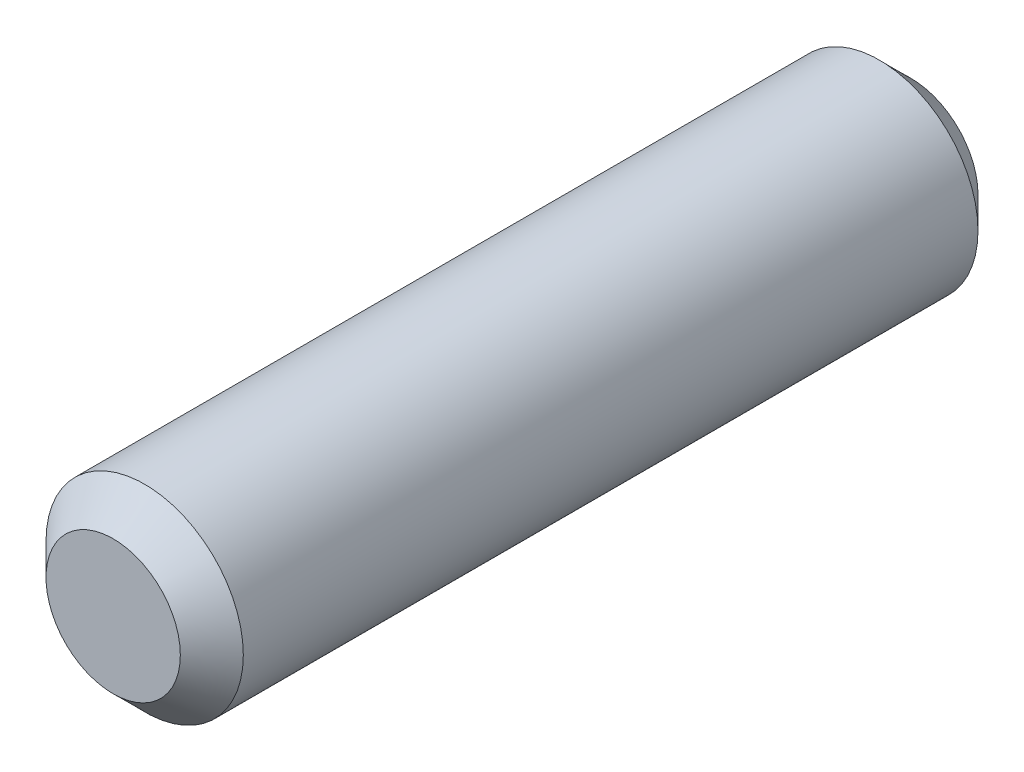
ISO-10303-21;
HEADER;
FILE_DESCRIPTION(('STEP AP214'),'2;1');
FILE_NAME('part.step','',(''),(''),'','','');
FILE_SCHEMA(('AUTOMOTIVE_DESIGN { 1 0 10303 214 1 1 1 1 }'));
ENDSEC;
DATA;
#1=APPLICATION_CONTEXT('core data for automotive mechanical design processes');
#2=APPLICATION_PROTOCOL_DEFINITION('international standard','automotive_design',2000,#1);
#3=PRODUCT_CONTEXT('',#1,'mechanical');
#4=PRODUCT('Part','Part','',(#3));
#5=PRODUCT_RELATED_PRODUCT_CATEGORY('part','',(#4));
#6=PRODUCT_DEFINITION_FORMATION('','',#4);
#7=PRODUCT_DEFINITION_CONTEXT('part definition',#1,'design');
#8=PRODUCT_DEFINITION('design','',#6,#7);
#9=PRODUCT_DEFINITION_SHAPE('','',#8);
#10=(LENGTH_UNIT() NAMED_UNIT(*) SI_UNIT(.MILLI.,.METRE.));
#11=(NAMED_UNIT(*) PLANE_ANGLE_UNIT() SI_UNIT($,.RADIAN.));
#12=(NAMED_UNIT(*) SI_UNIT($,.STERADIAN.) SOLID_ANGLE_UNIT());
#13=UNCERTAINTY_MEASURE_WITH_UNIT(LENGTH_MEASURE(1.E-05),#10,'distance_accuracy_value','');
#14=(GEOMETRIC_REPRESENTATION_CONTEXT(3) GLOBAL_UNCERTAINTY_ASSIGNED_CONTEXT((#13)) GLOBAL_UNIT_ASSIGNED_CONTEXT((#10,
#11,#12)) REPRESENTATION_CONTEXT('',''));
#15=CARTESIAN_POINT('',(0.,0.,0.));
#16=DIRECTION('',(0.,0.,1.));
#17=DIRECTION('',(1.,0.,0.));
#18=AXIS2_PLACEMENT_3D('',#15,#16,#17);
#19=CARTESIAN_POINT('',(0.,0.,19.));
#20=DIRECTION('',(0.,0.,-1.));
#21=DIRECTION('',(-1.,0.,0.));
#22=AXIS2_PLACEMENT_3D('',#19,#20,#21);
#23=CYLINDRICAL_SURFACE('',#22,2.35);
#24=CARTESIAN_POINT('',(0.,0.,18.25));
#25=DIRECTION('',(0.,0.,1.));
#26=DIRECTION('',(1.,0.,0.));
#27=AXIS2_PLACEMENT_3D('',#24,#25,#26);
#28=CIRCLE('',#27,2.35);
#29=CARTESIAN_POINT('',(2.35,0.,18.25));
#30=VERTEX_POINT('',#29);
#31=EDGE_CURVE('E51',#30,#30,#28,.F.);
#32=ORIENTED_EDGE('',*,*,#31,.T.);
#33=EDGE_LOOP('',(#32));
#34=FACE_BOUND('',#33,.T.);
#35=CARTESIAN_POINT('',(0.,0.,0.750000000000001));
#36=DIRECTION('',(0.,0.,1.));
#37=DIRECTION('',(1.,0.,0.));
#38=AXIS2_PLACEMENT_3D('',#35,#36,#37);
#39=CIRCLE('',#38,2.35);
#40=CARTESIAN_POINT('',(2.35,0.,0.750000000000001));
#41=VERTEX_POINT('',#40);
#42=EDGE_CURVE('E55',#41,#41,#39,.T.);
#43=ORIENTED_EDGE('',*,*,#42,.T.);
#44=EDGE_LOOP('',(#43));
#45=FACE_BOUND('',#44,.T.);
#46=ADVANCED_FACE('F43',(#34,#45),#23,.T.);
#47=CARTESIAN_POINT('',(0.,0.,19.));
#48=DIRECTION('',(0.,0.,1.));
#49=DIRECTION('',(1.,0.,0.));
#50=AXIS2_PLACEMENT_3D('',#47,#48,#49);
#51=PLANE('',#50);
#52=CARTESIAN_POINT('',(0.,0.,19.));
#53=DIRECTION('',(0.,0.,1.));
#54=DIRECTION('',(1.,0.,0.));
#55=AXIS2_PLACEMENT_3D('',#52,#53,#54);
#56=CIRCLE('',#55,1.6);
#57=CARTESIAN_POINT('',(1.6,0.,19.));
#58=VERTEX_POINT('',#57);
#59=EDGE_CURVE('E59',#58,#58,#56,.T.);
#60=ORIENTED_EDGE('',*,*,#59,.T.);
#61=EDGE_LOOP('',(#60));
#62=FACE_BOUND('',#61,.T.);
#63=ADVANCED_FACE('F65',(#62),#51,.T.);
#64=CARTESIAN_POINT('',(0.,0.,0.));
#65=DIRECTION('',(0.,0.,1.));
#66=DIRECTION('',(1.,0.,0.));
#67=AXIS2_PLACEMENT_3D('',#64,#65,#66);
#68=PLANE('',#67);
#69=CARTESIAN_POINT('',(0.,0.,0.));
#70=DIRECTION('',(0.,0.,1.));
#71=DIRECTION('',(1.,0.,0.));
#72=AXIS2_PLACEMENT_3D('',#69,#70,#71);
#73=CIRCLE('',#72,1.6);
#74=CARTESIAN_POINT('',(1.6,0.,0.));
#75=VERTEX_POINT('',#74);
#76=EDGE_CURVE('E12',#75,#75,#73,.F.);
#77=ORIENTED_EDGE('',*,*,#76,.T.);
#78=EDGE_LOOP('',(#77));
#79=FACE_BOUND('',#78,.T.);
#80=ADVANCED_FACE('F69',(#79),#68,.F.);
#81=CARTESIAN_POINT('',(0.,0.,19.));
#82=DIRECTION('',(0.,0.,-1.));
#83=DIRECTION('',(-1.,0.,0.));
#84=AXIS2_PLACEMENT_3D('',#81,#82,#83);
#85=CONICAL_SURFACE('',#84,1.6,0.785398163397448);
#86=ORIENTED_EDGE('',*,*,#31,.F.);
#87=EDGE_LOOP('',(#86));
#88=FACE_BOUND('',#87,.T.);
#89=ORIENTED_EDGE('',*,*,#59,.F.);
#90=EDGE_LOOP('',(#89));
#91=FACE_BOUND('',#90,.T.);
#92=ADVANCED_FACE('F67',(#88,#91),#85,.T.);
#93=CARTESIAN_POINT('',(0.,0.,0.750000000000001));
#94=DIRECTION('',(0.,0.,1.));
#95=DIRECTION('',(1.,0.,0.));
#96=AXIS2_PLACEMENT_3D('',#93,#94,#95);
#97=CONICAL_SURFACE('',#96,2.35,0.785398163397448);
#98=ORIENTED_EDGE('',*,*,#76,.F.);
#99=EDGE_LOOP('',(#98));
#100=FACE_BOUND('',#99,.T.);
#101=ORIENTED_EDGE('',*,*,#42,.F.);
#102=EDGE_LOOP('',(#101));
#103=FACE_BOUND('',#102,.T.);
#104=ADVANCED_FACE('F46',(#100,#103),#97,.T.);
#105=CLOSED_SHELL('',(#46,#63,#80,#92,#104));
#106=MANIFOLD_SOLID_BREP('B2',#105);
#107=ADVANCED_BREP_SHAPE_REPRESENTATION('',(#18,#106),#14);
#108=SHAPE_DEFINITION_REPRESENTATION(#9,#107);
ENDSEC;
END-ISO-10303-21;
